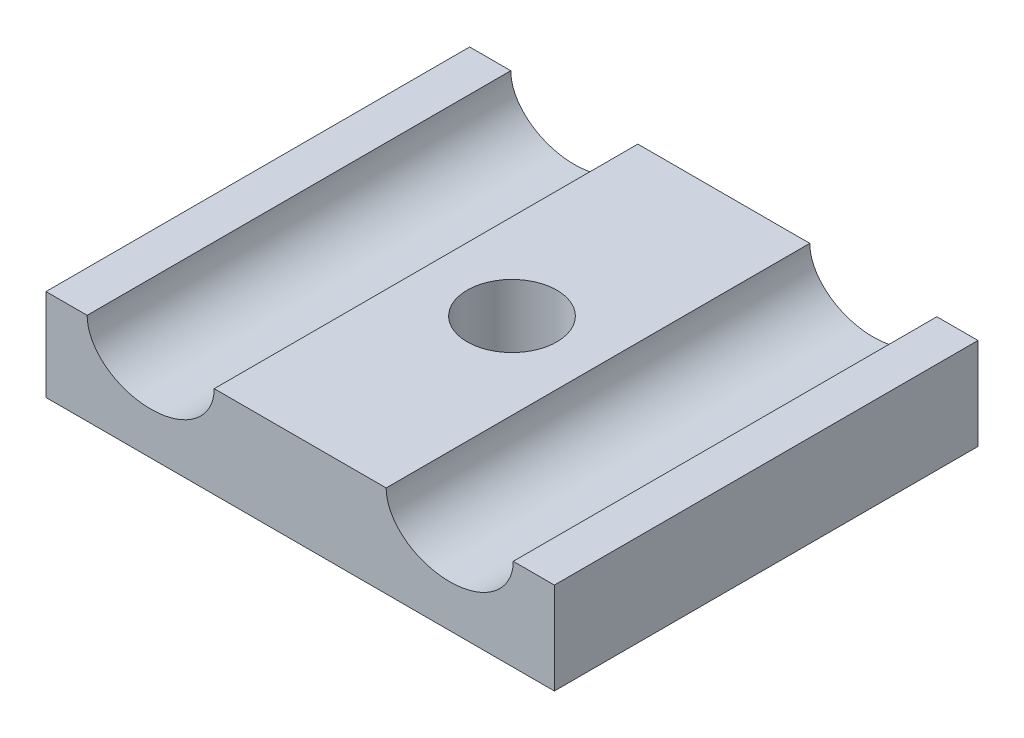
ISO-10303-21;
HEADER;
FILE_DESCRIPTION(('STEP AP214'),'2;1');
FILE_NAME('part.step','',(''),(''),'','','');
FILE_SCHEMA(('AUTOMOTIVE_DESIGN { 1 0 10303 214 1 1 1 1 }'));
ENDSEC;
DATA;
#1=APPLICATION_CONTEXT('core data for automotive mechanical design processes');
#2=APPLICATION_PROTOCOL_DEFINITION('international standard','automotive_design',2000,#1);
#3=PRODUCT_CONTEXT('',#1,'mechanical');
#4=PRODUCT('Part','Part','',(#3));
#5=PRODUCT_RELATED_PRODUCT_CATEGORY('part','',(#4));
#6=PRODUCT_DEFINITION_FORMATION('','',#4);
#7=PRODUCT_DEFINITION_CONTEXT('part definition',#1,'design');
#8=PRODUCT_DEFINITION('design','',#6,#7);
#9=PRODUCT_DEFINITION_SHAPE('','',#8);
#10=(LENGTH_UNIT() NAMED_UNIT(*) SI_UNIT(.MILLI.,.METRE.));
#11=(NAMED_UNIT(*) PLANE_ANGLE_UNIT() SI_UNIT($,.RADIAN.));
#12=(NAMED_UNIT(*) SI_UNIT($,.STERADIAN.) SOLID_ANGLE_UNIT());
#13=UNCERTAINTY_MEASURE_WITH_UNIT(LENGTH_MEASURE(1.E-05),#10,'distance_accuracy_value','');
#14=(GEOMETRIC_REPRESENTATION_CONTEXT(3) GLOBAL_UNCERTAINTY_ASSIGNED_CONTEXT((#13)) GLOBAL_UNIT_ASSIGNED_CONTEXT((#10,
#11,#12)) REPRESENTATION_CONTEXT('',''));
#15=CARTESIAN_POINT('',(0.,0.,0.));
#16=DIRECTION('',(0.,0.,1.));
#17=DIRECTION('',(1.,0.,0.));
#18=AXIS2_PLACEMENT_3D('',#15,#16,#17);
#19=CARTESIAN_POINT('',(0.,6.5,0.));
#20=DIRECTION('',(0.,-1.,0.));
#21=DIRECTION('',(0.,0.,-1.));
#22=AXIS2_PLACEMENT_3D('',#19,#20,#21);
#23=PLANE('',#22);
#24=CARTESIAN_POINT('',(-18.,6.5,15.));
#25=DIRECTION('',(0.,1.,0.));
#26=DIRECTION('',(0.,0.,1.));
#27=AXIS2_PLACEMENT_3D('',#24,#25,#26);
#28=CIRCLE('',#27,3.175);
#29=CARTESIAN_POINT('',(-18.,6.5,18.175));
#30=VERTEX_POINT('',#29);
#31=EDGE_CURVE('E203',#30,#30,#28,.T.);
#32=ORIENTED_EDGE('',*,*,#31,.F.);
#33=EDGE_LOOP('',(#32));
#34=FACE_BOUND('',#33,.T.);
#35=DIRECTION('',(-1.,0.,0.));
#36=VECTOR('',#35,1.);
#37=CARTESIAN_POINT('',(0.,6.5,0.));
#38=LINE('',#37,#36);
#39=CARTESIAN_POINT('',(-11.9125,6.5,0.));
#40=VERTEX_POINT('',#39);
#41=CARTESIAN_POINT('',(-24.0875,6.5,0.));
#42=VERTEX_POINT('',#41);
#43=EDGE_CURVE('E107',#40,#42,#38,.T.);
#44=ORIENTED_EDGE('',*,*,#43,.T.);
#45=DIRECTION('',(0.,0.,1.));
#46=VECTOR('',#45,1.);
#47=CARTESIAN_POINT('',(-24.0875,6.5,15.));
#48=LINE('',#47,#46);
#49=CARTESIAN_POINT('',(-24.0875,6.5,30.));
#50=VERTEX_POINT('',#49);
#51=EDGE_CURVE('E11',#42,#50,#48,.T.);
#52=ORIENTED_EDGE('',*,*,#51,.T.);
#53=DIRECTION('',(1.,0.,0.));
#54=VECTOR('',#53,1.);
#55=CARTESIAN_POINT('',(0.,6.5,30.));
#56=LINE('',#55,#54);
#57=CARTESIAN_POINT('',(-11.9125,6.5,30.));
#58=VERTEX_POINT('',#57);
#59=EDGE_CURVE('E126',#50,#58,#56,.T.);
#60=ORIENTED_EDGE('',*,*,#59,.T.);
#61=DIRECTION('',(0.,0.,1.));
#62=VECTOR('',#61,1.);
#63=CARTESIAN_POINT('',(-11.9125,6.5,15.));
#64=LINE('',#63,#62);
#65=EDGE_CURVE('E111',#58,#40,#64,.F.);
#66=ORIENTED_EDGE('',*,*,#65,.T.);
#67=EDGE_LOOP('',(#44,#52,#60,#66));
#68=FACE_BOUND('',#67,.T.);
#69=ADVANCED_FACE('F34',(#34,#68),#23,.F.);
#70=CARTESIAN_POINT('',(0.,6.5,0.));
#71=VERTEX_POINT('',#70);
#72=CARTESIAN_POINT('',(-2.91249999999999,6.5,0.));
#73=VERTEX_POINT('',#72);
#74=EDGE_CURVE('E112',#71,#73,#38,.T.);
#75=ORIENTED_EDGE('',*,*,#74,.T.);
#76=DIRECTION('',(0.,0.,1.));
#77=VECTOR('',#76,1.);
#78=CARTESIAN_POINT('',(-2.91249999999999,6.5,15.));
#79=LINE('',#78,#77);
#80=CARTESIAN_POINT('',(-2.91249999999999,6.5,30.));
#81=VERTEX_POINT('',#80);
#82=EDGE_CURVE('E149',#73,#81,#79,.T.);
#83=ORIENTED_EDGE('',*,*,#82,.T.);
#84=CARTESIAN_POINT('',(0.,6.5,30.));
#85=VERTEX_POINT('',#84);
#86=EDGE_CURVE('E121',#81,#85,#56,.T.);
#87=ORIENTED_EDGE('',*,*,#86,.T.);
#88=DIRECTION('',(0.,0.,-1.));
#89=VECTOR('',#88,1.);
#90=CARTESIAN_POINT('',(0.,6.5,0.));
#91=LINE('',#90,#89);
#92=EDGE_CURVE('E116',#85,#71,#91,.T.);
#93=ORIENTED_EDGE('',*,*,#92,.T.);
#94=EDGE_LOOP('',(#75,#83,#87,#93));
#95=FACE_BOUND('',#94,.T.);
#96=ADVANCED_FACE('F181',(#95),#23,.F.);
#97=CARTESIAN_POINT('',(0.,6.5,0.));
#98=DIRECTION('',(-1.,0.,0.));
#99=DIRECTION('',(0.,0.,1.));
#100=AXIS2_PLACEMENT_3D('',#97,#98,#99);
#101=PLANE('',#100);
#102=DIRECTION('',(0.,0.,-1.));
#103=VECTOR('',#102,1.);
#104=CARTESIAN_POINT('',(0.,0.,0.));
#105=LINE('',#104,#103);
#106=CARTESIAN_POINT('',(0.,0.,30.));
#107=VERTEX_POINT('',#106);
#108=CARTESIAN_POINT('',(0.,0.,0.));
#109=VERTEX_POINT('',#108);
#110=EDGE_CURVE('E127',#107,#109,#105,.T.);
#111=ORIENTED_EDGE('',*,*,#110,.T.);
#112=DIRECTION('',(0.,-1.,0.));
#113=VECTOR('',#112,1.);
#114=CARTESIAN_POINT('',(0.,6.5,0.));
#115=LINE('',#114,#113);
#116=EDGE_CURVE('E145',#71,#109,#115,.T.);
#117=ORIENTED_EDGE('',*,*,#116,.F.);
#118=ORIENTED_EDGE('',*,*,#92,.F.);
#119=DIRECTION('',(0.,-1.,0.));
#120=VECTOR('',#119,1.);
#121=CARTESIAN_POINT('',(0.,6.5,30.));
#122=LINE('',#121,#120);
#123=EDGE_CURVE('E125',#85,#107,#122,.T.);
#124=ORIENTED_EDGE('',*,*,#123,.T.);
#125=EDGE_LOOP('',(#111,#117,#118,#124));
#126=FACE_BOUND('',#125,.T.);
#127=ADVANCED_FACE('F36',(#126),#101,.F.);
#128=CARTESIAN_POINT('',(0.,6.5,0.));
#129=DIRECTION('',(0.,0.,1.));
#130=DIRECTION('',(1.,0.,0.));
#131=AXIS2_PLACEMENT_3D('',#128,#129,#130);
#132=PLANE('',#131);
#133=CARTESIAN_POINT('',(-33.0875,6.5,0.));
#134=VERTEX_POINT('',#133);
#135=CARTESIAN_POINT('',(-36.,6.5,0.));
#136=VERTEX_POINT('',#135);
#137=EDGE_CURVE('E109',#134,#136,#38,.T.);
#138=ORIENTED_EDGE('',*,*,#137,.F.);
#139=CARTESIAN_POINT('',(-28.5875,6.5,0.));
#140=DIRECTION('',(0.,0.,1.));
#141=DIRECTION('',(-1.,0.,0.));
#142=AXIS2_PLACEMENT_3D('',#139,#140,#141);
#143=ELLIPSE('',#142,4.5,3.5);
#144=EDGE_CURVE('E49',#42,#134,#143,.F.);
#145=ORIENTED_EDGE('',*,*,#144,.F.);
#146=ORIENTED_EDGE('',*,*,#43,.F.);
#147=CARTESIAN_POINT('',(-7.4125,6.5,0.));
#148=DIRECTION('',(0.,0.,1.));
#149=DIRECTION('',(-1.,0.,0.));
#150=AXIS2_PLACEMENT_3D('',#147,#148,#149);
#151=ELLIPSE('',#150,4.5,3.5);
#152=EDGE_CURVE('E57',#73,#40,#151,.F.);
#153=ORIENTED_EDGE('',*,*,#152,.F.);
#154=ORIENTED_EDGE('',*,*,#74,.F.);
#155=ORIENTED_EDGE('',*,*,#116,.T.);
#156=DIRECTION('',(-1.,0.,0.));
#157=VECTOR('',#156,1.);
#158=CARTESIAN_POINT('',(0.,0.,0.));
#159=LINE('',#158,#157);
#160=CARTESIAN_POINT('',(-36.,0.,0.));
#161=VERTEX_POINT('',#160);
#162=EDGE_CURVE('E130',#109,#161,#159,.T.);
#163=ORIENTED_EDGE('',*,*,#162,.T.);
#164=DIRECTION('',(0.,-1.,0.));
#165=VECTOR('',#164,1.);
#166=CARTESIAN_POINT('',(-36.,6.5,0.));
#167=LINE('',#166,#165);
#168=EDGE_CURVE('E142',#136,#161,#167,.T.);
#169=ORIENTED_EDGE('',*,*,#168,.F.);
#170=EDGE_LOOP('',(#138,#145,#146,#153,#154,#155,#163,#169));
#171=FACE_BOUND('',#170,.T.);
#172=ADVANCED_FACE('F106',(#171),#132,.F.);
#173=CARTESIAN_POINT('',(-36.,6.5,0.));
#174=DIRECTION('',(1.,0.,0.));
#175=DIRECTION('',(0.,0.,-1.));
#176=AXIS2_PLACEMENT_3D('',#173,#174,#175);
#177=PLANE('',#176);
#178=DIRECTION('',(0.,0.,1.));
#179=VECTOR('',#178,1.);
#180=CARTESIAN_POINT('',(-36.,0.,0.));
#181=LINE('',#180,#179);
#182=CARTESIAN_POINT('',(-36.,0.,30.));
#183=VERTEX_POINT('',#182);
#184=EDGE_CURVE('E133',#161,#183,#181,.T.);
#185=ORIENTED_EDGE('',*,*,#184,.T.);
#186=DIRECTION('',(0.,-1.,0.));
#187=VECTOR('',#186,1.);
#188=CARTESIAN_POINT('',(-36.,6.5,30.));
#189=LINE('',#188,#187);
#190=CARTESIAN_POINT('',(-36.,6.5,30.));
#191=VERTEX_POINT('',#190);
#192=EDGE_CURVE('E139',#191,#183,#189,.T.);
#193=ORIENTED_EDGE('',*,*,#192,.F.);
#194=DIRECTION('',(0.,0.,1.));
#195=VECTOR('',#194,1.);
#196=CARTESIAN_POINT('',(-36.,6.5,0.));
#197=LINE('',#196,#195);
#198=EDGE_CURVE('E115',#136,#191,#197,.T.);
#199=ORIENTED_EDGE('',*,*,#198,.F.);
#200=ORIENTED_EDGE('',*,*,#168,.T.);
#201=EDGE_LOOP('',(#185,#193,#199,#200));
#202=FACE_BOUND('',#201,.T.);
#203=ADVANCED_FACE('F187',(#202),#177,.F.);
#204=CARTESIAN_POINT('',(0.,6.5,30.));
#205=DIRECTION('',(0.,0.,-1.));
#206=DIRECTION('',(-1.,0.,0.));
#207=AXIS2_PLACEMENT_3D('',#204,#205,#206);
#208=PLANE('',#207);
#209=ORIENTED_EDGE('',*,*,#59,.F.);
#210=CARTESIAN_POINT('',(-28.5875,6.5,30.));
#211=DIRECTION('',(0.,0.,1.));
#212=DIRECTION('',(-1.,0.,0.));
#213=AXIS2_PLACEMENT_3D('',#210,#211,#212);
#214=ELLIPSE('',#213,4.5,3.5);
#215=CARTESIAN_POINT('',(-33.0875,6.5,30.));
#216=VERTEX_POINT('',#215);
#217=EDGE_CURVE('E99',#216,#50,#214,.T.);
#218=ORIENTED_EDGE('',*,*,#217,.F.);
#219=EDGE_CURVE('E122',#191,#216,#56,.T.);
#220=ORIENTED_EDGE('',*,*,#219,.F.);
#221=ORIENTED_EDGE('',*,*,#192,.T.);
#222=DIRECTION('',(1.,0.,0.));
#223=VECTOR('',#222,1.);
#224=CARTESIAN_POINT('',(0.,0.,30.));
#225=LINE('',#224,#223);
#226=EDGE_CURVE('E135',#183,#107,#225,.T.);
#227=ORIENTED_EDGE('',*,*,#226,.T.);
#228=ORIENTED_EDGE('',*,*,#123,.F.);
#229=ORIENTED_EDGE('',*,*,#86,.F.);
#230=CARTESIAN_POINT('',(-7.4125,6.5,30.));
#231=DIRECTION('',(0.,0.,1.));
#232=DIRECTION('',(-1.,0.,0.));
#233=AXIS2_PLACEMENT_3D('',#230,#231,#232);
#234=ELLIPSE('',#233,4.5,3.5);
#235=EDGE_CURVE('E157',#58,#81,#234,.T.);
#236=ORIENTED_EDGE('',*,*,#235,.F.);
#237=EDGE_LOOP('',(#209,#218,#220,#221,#227,#228,#229,#236));
#238=FACE_BOUND('',#237,.T.);
#239=ADVANCED_FACE('F155',(#238),#208,.F.);
#240=ORIENTED_EDGE('',*,*,#219,.T.);
#241=DIRECTION('',(0.,0.,1.));
#242=VECTOR('',#241,1.);
#243=CARTESIAN_POINT('',(-33.0875,6.5,15.));
#244=LINE('',#243,#242);
#245=EDGE_CURVE('E42',#216,#134,#244,.F.);
#246=ORIENTED_EDGE('',*,*,#245,.T.);
#247=ORIENTED_EDGE('',*,*,#137,.T.);
#248=ORIENTED_EDGE('',*,*,#198,.T.);
#249=EDGE_LOOP('',(#240,#246,#247,#248));
#250=FACE_BOUND('',#249,.T.);
#251=ADVANCED_FACE('F152',(#250),#23,.F.);
#252=CARTESIAN_POINT('',(0.,0.,0.));
#253=DIRECTION('',(0.,-1.,0.));
#254=DIRECTION('',(0.,0.,-1.));
#255=AXIS2_PLACEMENT_3D('',#252,#253,#254);
#256=PLANE('',#255);
#257=ORIENTED_EDGE('',*,*,#110,.F.);
#258=ORIENTED_EDGE('',*,*,#226,.F.);
#259=ORIENTED_EDGE('',*,*,#184,.F.);
#260=ORIENTED_EDGE('',*,*,#162,.F.);
#261=EDGE_LOOP('',(#257,#258,#259,#260));
#262=FACE_BOUND('',#261,.T.);
#263=ADVANCED_FACE('F177',(#262),#256,.T.);
#264=CARTESIAN_POINT('',(-18.,1.5,15.));
#265=DIRECTION('',(0.,1.,0.));
#266=DIRECTION('',(0.,0.,1.));
#267=AXIS2_PLACEMENT_3D('',#264,#265,#266);
#268=CYLINDRICAL_SURFACE('',#267,3.175);
#269=CARTESIAN_POINT('',(-18.,1.5,15.));
#270=DIRECTION('',(0.,1.,0.));
#271=DIRECTION('',(0.,0.,1.));
#272=AXIS2_PLACEMENT_3D('',#269,#270,#271);
#273=CIRCLE('',#272,3.175);
#274=CARTESIAN_POINT('',(-18.,1.5,18.175));
#275=VERTEX_POINT('',#274);
#276=EDGE_CURVE('E131',#275,#275,#273,.T.);
#277=ORIENTED_EDGE('',*,*,#276,.F.);
#278=EDGE_LOOP('',(#277));
#279=FACE_BOUND('',#278,.T.);
#280=ORIENTED_EDGE('',*,*,#31,.T.);
#281=EDGE_LOOP('',(#280));
#282=FACE_BOUND('',#281,.T.);
#283=ADVANCED_FACE('F173',(#279,#282),#268,.F.);
#284=CARTESIAN_POINT('',(-18.,1.5,15.));
#285=DIRECTION('',(0.,1.,0.));
#286=DIRECTION('',(0.,0.,1.));
#287=AXIS2_PLACEMENT_3D('',#284,#285,#286);
#288=PLANE('',#287);
#289=ORIENTED_EDGE('',*,*,#276,.T.);
#290=EDGE_LOOP('',(#289));
#291=FACE_BOUND('',#290,.T.);
#292=ADVANCED_FACE('F170',(#291),#288,.T.);
#293=CARTESIAN_POINT('',(-7.4125,6.5,-11.4017542509914));
#294=DIRECTION('',(0.,0.,1.));
#295=DIRECTION('',(-1.,0.,0.));
#296=AXIS2_PLACEMENT_3D('',#293,#294,#295);
#297=ELLIPSE('',#296,4.5,3.5);
#298=DIRECTION('',(0.,0.,1.));
#299=VECTOR('',#298,1.);
#300=SURFACE_OF_LINEAR_EXTRUSION('',#297,#299);
#301=ORIENTED_EDGE('',*,*,#152,.T.);
#302=ORIENTED_EDGE('',*,*,#65,.F.);
#303=ORIENTED_EDGE('',*,*,#235,.T.);
#304=ORIENTED_EDGE('',*,*,#82,.F.);
#305=EDGE_LOOP('',(#301,#302,#303,#304));
#306=FACE_BOUND('',#305,.T.);
#307=ADVANCED_FACE('F167',(#306),#300,.F.);
#308=CARTESIAN_POINT('',(-28.5875,6.5,-11.4017542509914));
#309=DIRECTION('',(0.,0.,1.));
#310=DIRECTION('',(-1.,0.,0.));
#311=AXIS2_PLACEMENT_3D('',#308,#309,#310);
#312=ELLIPSE('',#311,4.5,3.5);
#313=DIRECTION('',(0.,0.,1.));
#314=VECTOR('',#313,1.);
#315=SURFACE_OF_LINEAR_EXTRUSION('',#312,#314);
#316=ORIENTED_EDGE('',*,*,#144,.T.);
#317=ORIENTED_EDGE('',*,*,#245,.F.);
#318=ORIENTED_EDGE('',*,*,#217,.T.);
#319=ORIENTED_EDGE('',*,*,#51,.F.);
#320=EDGE_LOOP('',(#316,#317,#318,#319));
#321=FACE_BOUND('',#320,.T.);
#322=ADVANCED_FACE('F97',(#321),#315,.F.);
#323=CLOSED_SHELL('',(#69,#96,#127,#172,#203,#239,#251,#263,#283,#292,#307,#322));
#324=MANIFOLD_SOLID_BREP('B2',#323);
#325=ADVANCED_BREP_SHAPE_REPRESENTATION('',(#18,#324),#14);
#326=SHAPE_DEFINITION_REPRESENTATION(#9,#325);
ENDSEC;
END-ISO-10303-21;
